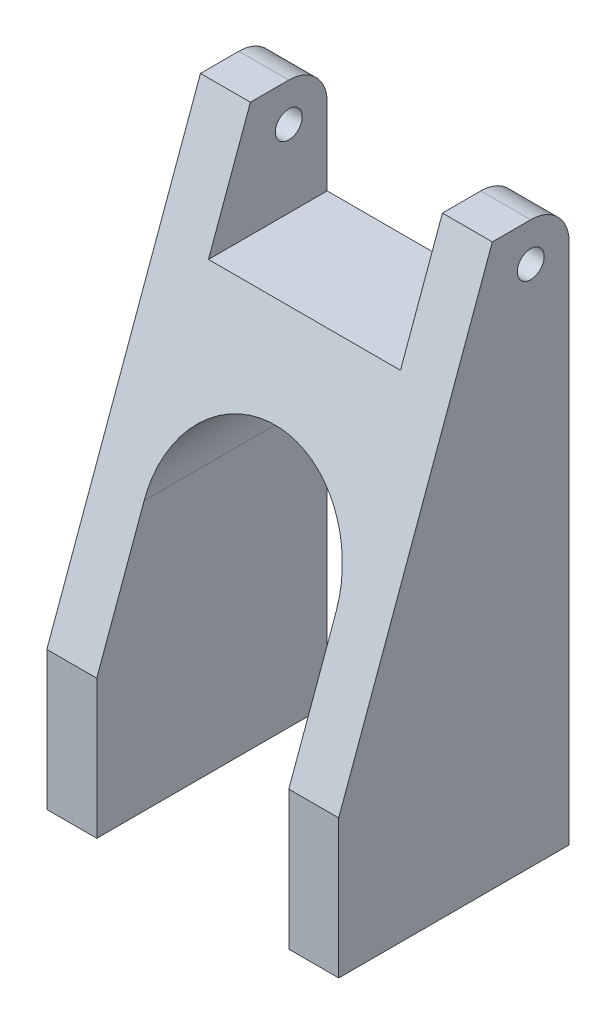
ISO-10303-21;
HEADER;
FILE_DESCRIPTION(('STEP AP214'),'2;1');
FILE_NAME('part.step','',(''),(''),'','','');
FILE_SCHEMA(('AUTOMOTIVE_DESIGN { 1 0 10303 214 1 1 1 1 }'));
ENDSEC;
DATA;
#1=APPLICATION_CONTEXT('core data for automotive mechanical design processes');
#2=APPLICATION_PROTOCOL_DEFINITION('international standard','automotive_design',2000,#1);
#3=PRODUCT_CONTEXT('',#1,'mechanical');
#4=PRODUCT('Part','Part','',(#3));
#5=PRODUCT_RELATED_PRODUCT_CATEGORY('part','',(#4));
#6=PRODUCT_DEFINITION_FORMATION('','',#4);
#7=PRODUCT_DEFINITION_CONTEXT('part definition',#1,'design');
#8=PRODUCT_DEFINITION('design','',#6,#7);
#9=PRODUCT_DEFINITION_SHAPE('','',#8);
#10=(LENGTH_UNIT() NAMED_UNIT(*) SI_UNIT(.MILLI.,.METRE.));
#11=(NAMED_UNIT(*) PLANE_ANGLE_UNIT() SI_UNIT($,.RADIAN.));
#12=(NAMED_UNIT(*) SI_UNIT($,.STERADIAN.) SOLID_ANGLE_UNIT());
#13=UNCERTAINTY_MEASURE_WITH_UNIT(LENGTH_MEASURE(1.E-05),#10,'distance_accuracy_value','');
#14=(GEOMETRIC_REPRESENTATION_CONTEXT(3) GLOBAL_UNCERTAINTY_ASSIGNED_CONTEXT((#13)) GLOBAL_UNIT_ASSIGNED_CONTEXT((#10,
#11,#12)) REPRESENTATION_CONTEXT('',''));
#15=CARTESIAN_POINT('',(0.,0.,0.));
#16=DIRECTION('',(0.,0.,1.));
#17=DIRECTION('',(1.,0.,0.));
#18=AXIS2_PLACEMENT_3D('',#15,#16,#17);
#19=CARTESIAN_POINT('',(-19.,38.,30.));
#20=DIRECTION('',(0.,-1.,0.));
#21=DIRECTION('',(0.,0.,-1.));
#22=AXIS2_PLACEMENT_3D('',#19,#20,#21);
#23=PLANE('',#22);
#24=DIRECTION('',(-1.,0.,0.));
#25=VECTOR('',#24,1.);
#26=CARTESIAN_POINT('',(-19.,38.,5.));
#27=LINE('',#26,#25);
#28=CARTESIAN_POINT('',(19.,38.,5.));
#29=VERTEX_POINT('',#28);
#30=CARTESIAN_POINT('',(12.5,38.,4.99999999999999));
#31=VERTEX_POINT('',#30);
#32=EDGE_CURVE('E163',#29,#31,#27,.T.);
#33=ORIENTED_EDGE('',*,*,#32,.T.);
#34=DIRECTION('',(0.,0.,-1.));
#35=VECTOR('',#34,1.);
#36=CARTESIAN_POINT('',(12.5,38.,-19.7984761471579));
#37=LINE('',#36,#35);
#38=CARTESIAN_POINT('',(12.5,38.,9.99999999999961));
#39=VERTEX_POINT('',#38);
#40=EDGE_CURVE('E155',#39,#31,#37,.T.);
#41=ORIENTED_EDGE('',*,*,#40,.F.);
#42=DIRECTION('',(1.,0.,0.));
#43=VECTOR('',#42,1.);
#44=CARTESIAN_POINT('',(19.,38.,9.99999999999961));
#45=LINE('',#44,#43);
#46=CARTESIAN_POINT('',(19.,38.,9.99999999999961));
#47=VERTEX_POINT('',#46);
#48=EDGE_CURVE('E64',#39,#47,#45,.T.);
#49=ORIENTED_EDGE('',*,*,#48,.T.);
#50=DIRECTION('',(0.,0.,-1.));
#51=VECTOR('',#50,1.);
#52=CARTESIAN_POINT('',(19.,38.,30.));
#53=LINE('',#52,#51);
#54=EDGE_CURVE('E286',#47,#29,#53,.T.);
#55=ORIENTED_EDGE('',*,*,#54,.T.);
#56=EDGE_LOOP('',(#33,#41,#49,#55));
#57=FACE_BOUND('',#56,.T.);
#58=ADVANCED_FACE('F39',(#57),#23,.F.);
#59=CARTESIAN_POINT('',(-19.,33.,5.));
#60=DIRECTION('',(-1.,0.,0.));
#61=DIRECTION('',(0.,0.,1.));
#62=AXIS2_PLACEMENT_3D('',#59,#60,#61);
#63=CYLINDRICAL_SURFACE('',#62,5.);
#64=CARTESIAN_POINT('',(12.5,33.,5.));
#65=DIRECTION('',(1.,0.,0.));
#66=DIRECTION('',(0.,0.,-1.));
#67=AXIS2_PLACEMENT_3D('',#64,#65,#66);
#68=CIRCLE('',#67,5.);
#69=CARTESIAN_POINT('',(12.5,33.,0.));
#70=VERTEX_POINT('',#69);
#71=EDGE_CURVE('E205',#31,#70,#68,.F.);
#72=ORIENTED_EDGE('',*,*,#71,.F.);
#73=ORIENTED_EDGE('',*,*,#32,.F.);
#74=CARTESIAN_POINT('',(19.,33.,5.));
#75=DIRECTION('',(-1.,0.,0.));
#76=DIRECTION('',(0.,0.,1.));
#77=AXIS2_PLACEMENT_3D('',#74,#75,#76);
#78=CIRCLE('',#77,5.);
#79=CARTESIAN_POINT('',(19.,33.,0.));
#80=VERTEX_POINT('',#79);
#81=EDGE_CURVE('E303',#80,#29,#78,.F.);
#82=ORIENTED_EDGE('',*,*,#81,.F.);
#83=DIRECTION('',(-1.,0.,0.));
#84=VECTOR('',#83,1.);
#85=CARTESIAN_POINT('',(0.,33.,0.));
#86=LINE('',#85,#84);
#87=EDGE_CURVE('E300',#70,#80,#86,.F.);
#88=ORIENTED_EDGE('',*,*,#87,.F.);
#89=EDGE_LOOP('',(#72,#73,#82,#88));
#90=FACE_BOUND('',#89,.T.);
#91=ADVANCED_FACE('F366',(#90),#63,.T.);
#92=CARTESIAN_POINT('',(0.,0.,30.));
#93=DIRECTION('',(0.,0.,1.));
#94=DIRECTION('',(1.,0.,0.));
#95=AXIS2_PLACEMENT_3D('',#92,#93,#94);
#96=PLANE('',#95);
#97=DIRECTION('',(0.,1.,0.));
#98=VECTOR('',#97,1.);
#99=CARTESIAN_POINT('',(19.,38.,30.));
#100=LINE('',#99,#98);
#101=CARTESIAN_POINT('',(19.,-35.,30.));
#102=VERTEX_POINT('',#101);
#103=CARTESIAN_POINT('',(19.,-16.9495483890942,30.));
#104=VERTEX_POINT('',#103);
#105=EDGE_CURVE('E250',#102,#104,#100,.T.);
#106=ORIENTED_EDGE('',*,*,#105,.T.);
#107=DIRECTION('',(-1.,0.,0.));
#108=VECTOR('',#107,1.);
#109=CARTESIAN_POINT('',(-19.,-16.9495483890942,30.));
#110=LINE('',#109,#108);
#111=CARTESIAN_POINT('',(12.5,-16.9495483890942,30.));
#112=VERTEX_POINT('',#111);
#113=EDGE_CURVE('E308',#104,#112,#110,.T.);
#114=ORIENTED_EDGE('',*,*,#113,.T.);
#115=DIRECTION('',(0.,-1.,0.));
#116=VECTOR('',#115,1.);
#117=CARTESIAN_POINT('',(12.5,-35.,30.));
#118=LINE('',#117,#116);
#119=CARTESIAN_POINT('',(12.5,-35.,30.));
#120=VERTEX_POINT('',#119);
#121=EDGE_CURVE('E245',#112,#120,#118,.T.);
#122=ORIENTED_EDGE('',*,*,#121,.T.);
#123=DIRECTION('',(1.,0.,0.));
#124=VECTOR('',#123,1.);
#125=CARTESIAN_POINT('',(12.5,-35.,30.));
#126=LINE('',#125,#124);
#127=EDGE_CURVE('E247',#120,#102,#126,.T.);
#128=ORIENTED_EDGE('',*,*,#127,.T.);
#129=EDGE_LOOP('',(#106,#114,#122,#128));
#130=FACE_BOUND('',#129,.T.);
#131=ADVANCED_FACE('F353',(#130),#96,.T.);
#132=CARTESIAN_POINT('',(0.,0.,30.));
#133=DIRECTION('',(0.,0.,-1.));
#134=DIRECTION('',(-1.,0.,0.));
#135=AXIS2_PLACEMENT_3D('',#132,#133,#134);
#136=CYLINDRICAL_SURFACE('',#135,12.5);
#137=DIRECTION('',(0.,0.,-1.));
#138=VECTOR('',#137,1.);
#139=CARTESIAN_POINT('',(12.5,0.,30.));
#140=LINE('',#139,#138);
#141=CARTESIAN_POINT('',(12.5,0.,23.8308689021151));
#142=VERTEX_POINT('',#141);
#143=CARTESIAN_POINT('',(12.5,0.,0.));
#144=VERTEX_POINT('',#143);
#145=EDGE_CURVE('E294',#142,#144,#140,.T.);
#146=ORIENTED_EDGE('',*,*,#145,.F.);
#147=CARTESIAN_POINT('',(0.,0.,23.8308689021151));
#148=DIRECTION('',(0.,0.342020143325665,0.93969262078591));
#149=DIRECTION('',(0.,0.93969262078591,-0.342020143325665));
#150=AXIS2_PLACEMENT_3D('',#147,#148,#149);
#151=ELLIPSE('',#150,13.3022221559489,12.5);
#152=CARTESIAN_POINT('',(-12.5,0.,23.8308689021151));
#153=VERTEX_POINT('',#152);
#154=EDGE_CURVE('E313',#142,#153,#151,.T.);
#155=ORIENTED_EDGE('',*,*,#154,.T.);
#156=DIRECTION('',(0.,0.,-1.));
#157=VECTOR('',#156,1.);
#158=CARTESIAN_POINT('',(-12.5,0.,30.));
#159=LINE('',#158,#157);
#160=CARTESIAN_POINT('',(-12.5,0.,0.));
#161=VERTEX_POINT('',#160);
#162=EDGE_CURVE('E260',#153,#161,#159,.T.);
#163=ORIENTED_EDGE('',*,*,#162,.T.);
#164=CARTESIAN_POINT('',(0.,0.,0.));
#165=DIRECTION('',(0.,0.,-1.));
#166=DIRECTION('',(1.,0.,0.));
#167=AXIS2_PLACEMENT_3D('',#164,#165,#166);
#168=CIRCLE('',#167,12.5);
#169=EDGE_CURVE('E242',#161,#144,#168,.T.);
#170=ORIENTED_EDGE('',*,*,#169,.T.);
#171=EDGE_LOOP('',(#146,#155,#163,#170));
#172=FACE_BOUND('',#171,.T.);
#173=ADVANCED_FACE('F349',(#172),#136,.F.);
#174=CARTESIAN_POINT('',(12.5,-35.,30.));
#175=DIRECTION('',(1.,0.,0.));
#176=DIRECTION('',(0.,1.,0.));
#177=AXIS2_PLACEMENT_3D('',#174,#175,#176);
#178=PLANE('',#177);
#179=ORIENTED_EDGE('',*,*,#121,.F.);
#180=DIRECTION('',(0.,0.93969262078591,-0.342020143325665));
#181=VECTOR('',#180,1.);
#182=CARTESIAN_POINT('',(12.5,-16.9495483890942,30.));
#183=LINE('',#182,#181);
#184=EDGE_CURVE('E311',#112,#142,#183,.T.);
#185=ORIENTED_EDGE('',*,*,#184,.T.);
#186=ORIENTED_EDGE('',*,*,#145,.T.);
#187=DIRECTION('',(0.,-1.,0.));
#188=VECTOR('',#187,1.);
#189=CARTESIAN_POINT('',(12.5,-35.,0.));
#190=LINE('',#189,#188);
#191=CARTESIAN_POINT('',(12.5,-35.,0.));
#192=VERTEX_POINT('',#191);
#193=EDGE_CURVE('E263',#144,#192,#190,.T.);
#194=ORIENTED_EDGE('',*,*,#193,.T.);
#195=DIRECTION('',(0.,0.,-1.));
#196=VECTOR('',#195,1.);
#197=CARTESIAN_POINT('',(12.5,-35.,30.));
#198=LINE('',#197,#196);
#199=EDGE_CURVE('E291',#120,#192,#198,.T.);
#200=ORIENTED_EDGE('',*,*,#199,.F.);
#201=EDGE_LOOP('',(#179,#185,#186,#194,#200));
#202=FACE_BOUND('',#201,.T.);
#203=ADVANCED_FACE('F356',(#202),#178,.F.);
#204=CARTESIAN_POINT('',(12.5,-35.,30.));
#205=DIRECTION('',(0.,1.,0.));
#206=DIRECTION('',(-1.,0.,0.));
#207=AXIS2_PLACEMENT_3D('',#204,#205,#206);
#208=PLANE('',#207);
#209=CARTESIAN_POINT('',(15.,-35.,15.));
#210=DIRECTION('',(0.,-1.,0.));
#211=DIRECTION('',(0.,0.,-1.));
#212=AXIS2_PLACEMENT_3D('',#209,#210,#211);
#213=CIRCLE('',#212,2.);
#214=CARTESIAN_POINT('',(15.,-35.,13.));
#215=VERTEX_POINT('',#214);
#216=EDGE_CURVE('E215',#215,#215,#213,.T.);
#217=ORIENTED_EDGE('',*,*,#216,.F.);
#218=EDGE_LOOP('',(#217));
#219=FACE_BOUND('',#218,.T.);
#220=CARTESIAN_POINT('',(15.,-35.,5.));
#221=DIRECTION('',(0.,-1.,0.));
#222=DIRECTION('',(0.,0.,-1.));
#223=AXIS2_PLACEMENT_3D('',#220,#221,#222);
#224=CIRCLE('',#223,2.);
#225=CARTESIAN_POINT('',(15.,-35.,3.));
#226=VERTEX_POINT('',#225);
#227=EDGE_CURVE('E227',#226,#226,#224,.T.);
#228=ORIENTED_EDGE('',*,*,#227,.F.);
#229=EDGE_LOOP('',(#228));
#230=FACE_BOUND('',#229,.T.);
#231=CARTESIAN_POINT('',(15.,-35.,25.));
#232=DIRECTION('',(0.,-1.,0.));
#233=DIRECTION('',(0.,0.,-1.));
#234=AXIS2_PLACEMENT_3D('',#231,#232,#233);
#235=CIRCLE('',#234,2.);
#236=CARTESIAN_POINT('',(15.,-35.,23.));
#237=VERTEX_POINT('',#236);
#238=EDGE_CURVE('E209',#237,#237,#235,.T.);
#239=ORIENTED_EDGE('',*,*,#238,.F.);
#240=EDGE_LOOP('',(#239));
#241=FACE_BOUND('',#240,.T.);
#242=DIRECTION('',(1.,0.,0.));
#243=VECTOR('',#242,1.);
#244=CARTESIAN_POINT('',(12.5,-35.,0.));
#245=LINE('',#244,#243);
#246=CARTESIAN_POINT('',(19.,-35.,0.));
#247=VERTEX_POINT('',#246);
#248=EDGE_CURVE('E265',#192,#247,#245,.T.);
#249=ORIENTED_EDGE('',*,*,#248,.T.);
#250=DIRECTION('',(0.,0.,-1.));
#251=VECTOR('',#250,1.);
#252=CARTESIAN_POINT('',(19.,-35.,30.));
#253=LINE('',#252,#251);
#254=EDGE_CURVE('E288',#102,#247,#253,.T.);
#255=ORIENTED_EDGE('',*,*,#254,.F.);
#256=ORIENTED_EDGE('',*,*,#127,.F.);
#257=ORIENTED_EDGE('',*,*,#199,.T.);
#258=EDGE_LOOP('',(#249,#255,#256,#257));
#259=FACE_BOUND('',#258,.T.);
#260=ADVANCED_FACE('F360',(#219,#230,#241,#259),#208,.F.);
#261=CARTESIAN_POINT('',(19.,38.,30.));
#262=DIRECTION('',(-1.,0.,0.));
#263=DIRECTION('',(0.,0.,1.));
#264=AXIS2_PLACEMENT_3D('',#261,#262,#263);
#265=PLANE('',#264);
#266=CARTESIAN_POINT('',(19.,33.,5.));
#267=DIRECTION('',(-1.,0.,0.));
#268=DIRECTION('',(0.,0.,1.));
#269=AXIS2_PLACEMENT_3D('',#266,#267,#268);
#270=CIRCLE('',#269,1.75);
#271=CARTESIAN_POINT('',(19.,33.,6.75));
#272=VERTEX_POINT('',#271);
#273=EDGE_CURVE('E635',#272,#272,#270,.T.);
#274=ORIENTED_EDGE('',*,*,#273,.T.);
#275=EDGE_LOOP('',(#274));
#276=FACE_BOUND('',#275,.T.);
#277=ORIENTED_EDGE('',*,*,#54,.F.);
#278=DIRECTION('',(0.,-0.93969262078591,0.342020143325665));
#279=VECTOR('',#278,1.);
#280=CARTESIAN_POINT('',(19.,-16.9495483890942,30.));
#281=LINE('',#280,#279);
#282=EDGE_CURVE('E169',#47,#104,#281,.T.);
#283=ORIENTED_EDGE('',*,*,#282,.T.);
#284=ORIENTED_EDGE('',*,*,#105,.F.);
#285=ORIENTED_EDGE('',*,*,#254,.T.);
#286=DIRECTION('',(0.,1.,0.));
#287=VECTOR('',#286,1.);
#288=CARTESIAN_POINT('',(19.,38.,0.));
#289=LINE('',#288,#287);
#290=EDGE_CURVE('E267',#247,#80,#289,.T.);
#291=ORIENTED_EDGE('',*,*,#290,.T.);
#292=ORIENTED_EDGE('',*,*,#81,.T.);
#293=EDGE_LOOP('',(#277,#283,#284,#285,#291,#292));
#294=FACE_BOUND('',#293,.T.);
#295=ADVANCED_FACE('F363',(#276,#294),#265,.F.);
#296=CARTESIAN_POINT('',(-19.,38.,9.99999999999961));
#297=VERTEX_POINT('',#296);
#298=CARTESIAN_POINT('',(-12.5,38.,9.99999999999961));
#299=VERTEX_POINT('',#298);
#300=EDGE_CURVE('E170',#297,#299,#45,.T.);
#301=ORIENTED_EDGE('',*,*,#300,.T.);
#302=DIRECTION('',(0.,0.,1.));
#303=VECTOR('',#302,1.);
#304=CARTESIAN_POINT('',(-12.5,38.,-19.7984761471579));
#305=LINE('',#304,#303);
#306=CARTESIAN_POINT('',(-12.5,38.,4.99999999999999));
#307=VERTEX_POINT('',#306);
#308=EDGE_CURVE('E164',#307,#299,#305,.T.);
#309=ORIENTED_EDGE('',*,*,#308,.F.);
#310=CARTESIAN_POINT('',(-19.,38.,5.));
#311=VERTEX_POINT('',#310);
#312=EDGE_CURVE('E296',#307,#311,#27,.T.);
#313=ORIENTED_EDGE('',*,*,#312,.T.);
#314=DIRECTION('',(0.,0.,-1.));
#315=VECTOR('',#314,1.);
#316=CARTESIAN_POINT('',(-19.,38.,30.));
#317=LINE('',#316,#315);
#318=EDGE_CURVE('E283',#297,#311,#317,.T.);
#319=ORIENTED_EDGE('',*,*,#318,.F.);
#320=EDGE_LOOP('',(#301,#309,#313,#319));
#321=FACE_BOUND('',#320,.T.);
#322=ADVANCED_FACE('F333',(#321),#23,.F.);
#323=CARTESIAN_POINT('',(-19.,-35.,30.));
#324=DIRECTION('',(1.,0.,0.));
#325=DIRECTION('',(0.,0.,-1.));
#326=AXIS2_PLACEMENT_3D('',#323,#324,#325);
#327=PLANE('',#326);
#328=CARTESIAN_POINT('',(-19.,33.,5.));
#329=DIRECTION('',(-1.,0.,0.));
#330=DIRECTION('',(0.,0.,1.));
#331=AXIS2_PLACEMENT_3D('',#328,#329,#330);
#332=CIRCLE('',#331,1.75);
#333=CARTESIAN_POINT('',(-19.,33.,6.75));
#334=VERTEX_POINT('',#333);
#335=EDGE_CURVE('E641',#334,#334,#332,.T.);
#336=ORIENTED_EDGE('',*,*,#335,.F.);
#337=EDGE_LOOP('',(#336));
#338=FACE_BOUND('',#337,.T.);
#339=DIRECTION('',(0.,-1.,0.));
#340=VECTOR('',#339,1.);
#341=CARTESIAN_POINT('',(-19.,-35.,30.));
#342=LINE('',#341,#340);
#343=CARTESIAN_POINT('',(-19.,-16.9495483890942,30.));
#344=VERTEX_POINT('',#343);
#345=CARTESIAN_POINT('',(-19.,-35.,30.));
#346=VERTEX_POINT('',#345);
#347=EDGE_CURVE('E253',#344,#346,#342,.T.);
#348=ORIENTED_EDGE('',*,*,#347,.F.);
#349=DIRECTION('',(0.,0.93969262078591,-0.342020143325665));
#350=VECTOR('',#349,1.);
#351=CARTESIAN_POINT('',(-19.,-16.9495483890942,30.));
#352=LINE('',#351,#350);
#353=EDGE_CURVE('E171',#344,#297,#352,.T.);
#354=ORIENTED_EDGE('',*,*,#353,.T.);
#355=ORIENTED_EDGE('',*,*,#318,.T.);
#356=CARTESIAN_POINT('',(-19.,33.,5.));
#357=DIRECTION('',(1.,0.,0.));
#358=DIRECTION('',(0.,0.,-1.));
#359=AXIS2_PLACEMENT_3D('',#356,#357,#358);
#360=CIRCLE('',#359,5.);
#361=CARTESIAN_POINT('',(-19.,33.,0.));
#362=VERTEX_POINT('',#361);
#363=EDGE_CURVE('E298',#311,#362,#360,.F.);
#364=ORIENTED_EDGE('',*,*,#363,.T.);
#365=DIRECTION('',(0.,-1.,0.));
#366=VECTOR('',#365,1.);
#367=CARTESIAN_POINT('',(-19.,-35.,0.));
#368=LINE('',#367,#366);
#369=CARTESIAN_POINT('',(-19.,-35.,0.));
#370=VERTEX_POINT('',#369);
#371=EDGE_CURVE('E270',#362,#370,#368,.T.);
#372=ORIENTED_EDGE('',*,*,#371,.T.);
#373=DIRECTION('',(0.,0.,-1.));
#374=VECTOR('',#373,1.);
#375=CARTESIAN_POINT('',(-19.,-35.,30.));
#376=LINE('',#375,#374);
#377=EDGE_CURVE('E280',#346,#370,#376,.T.);
#378=ORIENTED_EDGE('',*,*,#377,.F.);
#379=EDGE_LOOP('',(#348,#354,#355,#364,#372,#378));
#380=FACE_BOUND('',#379,.T.);
#381=ADVANCED_FACE('F329',(#338,#380),#327,.F.);
#382=CARTESIAN_POINT('',(-19.,-35.,30.));
#383=DIRECTION('',(0.,1.,0.));
#384=DIRECTION('',(-1.,0.,0.));
#385=AXIS2_PLACEMENT_3D('',#382,#383,#384);
#386=PLANE('',#385);
#387=CARTESIAN_POINT('',(-15.,-35.,25.));
#388=DIRECTION('',(0.,-1.,0.));
#389=DIRECTION('',(0.,0.,-1.));
#390=AXIS2_PLACEMENT_3D('',#387,#388,#389);
#391=CIRCLE('',#390,2.);
#392=CARTESIAN_POINT('',(-15.,-35.,23.));
#393=VERTEX_POINT('',#392);
#394=EDGE_CURVE('E222',#393,#393,#391,.T.);
#395=ORIENTED_EDGE('',*,*,#394,.F.);
#396=EDGE_LOOP('',(#395));
#397=FACE_BOUND('',#396,.T.);
#398=CARTESIAN_POINT('',(-15.,-35.,15.));
#399=DIRECTION('',(0.,-1.,0.));
#400=DIRECTION('',(0.,0.,-1.));
#401=AXIS2_PLACEMENT_3D('',#398,#399,#400);
#402=CIRCLE('',#401,2.);
#403=CARTESIAN_POINT('',(-15.,-35.,13.));
#404=VERTEX_POINT('',#403);
#405=EDGE_CURVE('E234',#404,#404,#402,.T.);
#406=ORIENTED_EDGE('',*,*,#405,.F.);
#407=EDGE_LOOP('',(#406));
#408=FACE_BOUND('',#407,.T.);
#409=CARTESIAN_POINT('',(-15.,-35.,5.));
#410=DIRECTION('',(0.,-1.,0.));
#411=DIRECTION('',(0.,0.,-1.));
#412=AXIS2_PLACEMENT_3D('',#409,#410,#411);
#413=CIRCLE('',#412,2.);
#414=CARTESIAN_POINT('',(-15.,-35.,3.));
#415=VERTEX_POINT('',#414);
#416=EDGE_CURVE('E230',#415,#415,#413,.T.);
#417=ORIENTED_EDGE('',*,*,#416,.F.);
#418=EDGE_LOOP('',(#417));
#419=FACE_BOUND('',#418,.T.);
#420=DIRECTION('',(1.,0.,0.));
#421=VECTOR('',#420,1.);
#422=CARTESIAN_POINT('',(-19.,-35.,0.));
#423=LINE('',#422,#421);
#424=CARTESIAN_POINT('',(-12.5,-35.,0.));
#425=VERTEX_POINT('',#424);
#426=EDGE_CURVE('E272',#370,#425,#423,.T.);
#427=ORIENTED_EDGE('',*,*,#426,.T.);
#428=DIRECTION('',(0.,0.,-1.));
#429=VECTOR('',#428,1.);
#430=CARTESIAN_POINT('',(-12.5,-35.,30.));
#431=LINE('',#430,#429);
#432=CARTESIAN_POINT('',(-12.5,-35.,30.));
#433=VERTEX_POINT('',#432);
#434=EDGE_CURVE('E277',#433,#425,#431,.T.);
#435=ORIENTED_EDGE('',*,*,#434,.F.);
#436=DIRECTION('',(1.,0.,0.));
#437=VECTOR('',#436,1.);
#438=CARTESIAN_POINT('',(-19.,-35.,30.));
#439=LINE('',#438,#437);
#440=EDGE_CURVE('E255',#346,#433,#439,.T.);
#441=ORIENTED_EDGE('',*,*,#440,.F.);
#442=ORIENTED_EDGE('',*,*,#377,.T.);
#443=EDGE_LOOP('',(#427,#435,#441,#442));
#444=FACE_BOUND('',#443,.T.);
#445=ADVANCED_FACE('F344',(#397,#408,#419,#444),#386,.F.);
#446=CARTESIAN_POINT('',(-12.5,0.,30.));
#447=DIRECTION('',(-1.,0.,0.));
#448=DIRECTION('',(0.,-1.,0.));
#449=AXIS2_PLACEMENT_3D('',#446,#447,#448);
#450=PLANE('',#449);
#451=ORIENTED_EDGE('',*,*,#162,.F.);
#452=DIRECTION('',(0.,-0.93969262078591,0.342020143325665));
#453=VECTOR('',#452,1.);
#454=CARTESIAN_POINT('',(-12.5,-16.9495483890942,30.));
#455=LINE('',#454,#453);
#456=CARTESIAN_POINT('',(-12.5,-16.9495483890942,30.));
#457=VERTEX_POINT('',#456);
#458=EDGE_CURVE('E174',#153,#457,#455,.T.);
#459=ORIENTED_EDGE('',*,*,#458,.T.);
#460=DIRECTION('',(0.,1.,0.));
#461=VECTOR('',#460,1.);
#462=CARTESIAN_POINT('',(-12.5,0.,30.));
#463=LINE('',#462,#461);
#464=EDGE_CURVE('E257',#433,#457,#463,.T.);
#465=ORIENTED_EDGE('',*,*,#464,.F.);
#466=ORIENTED_EDGE('',*,*,#434,.T.);
#467=DIRECTION('',(0.,1.,0.));
#468=VECTOR('',#467,1.);
#469=CARTESIAN_POINT('',(-12.5,0.,0.));
#470=LINE('',#469,#468);
#471=EDGE_CURVE('E248',#425,#161,#470,.T.);
#472=ORIENTED_EDGE('',*,*,#471,.T.);
#473=EDGE_LOOP('',(#451,#459,#465,#466,#472));
#474=FACE_BOUND('',#473,.T.);
#475=ADVANCED_FACE('F318',(#474),#450,.F.);
#476=ORIENTED_EDGE('',*,*,#464,.T.);
#477=DIRECTION('',(-1.,0.,0.));
#478=VECTOR('',#477,1.);
#479=CARTESIAN_POINT('',(-19.,-16.9495483890942,30.));
#480=LINE('',#479,#478);
#481=EDGE_CURVE('E306',#457,#344,#480,.T.);
#482=ORIENTED_EDGE('',*,*,#481,.T.);
#483=ORIENTED_EDGE('',*,*,#347,.T.);
#484=ORIENTED_EDGE('',*,*,#440,.T.);
#485=EDGE_LOOP('',(#476,#482,#483,#484));
#486=FACE_BOUND('',#485,.T.);
#487=ADVANCED_FACE('F322',(#486),#96,.T.);
#488=CARTESIAN_POINT('',(0.,0.,0.));
#489=DIRECTION('',(0.,0.,1.));
#490=DIRECTION('',(1.,0.,0.));
#491=AXIS2_PLACEMENT_3D('',#488,#489,#490);
#492=PLANE('',#491);
#493=DIRECTION('',(-1.,0.,0.));
#494=VECTOR('',#493,1.);
#495=CARTESIAN_POINT('',(0.,23.,0.));
#496=LINE('',#495,#494);
#497=CARTESIAN_POINT('',(12.5,23.,0.));
#498=VERTEX_POINT('',#497);
#499=CARTESIAN_POINT('',(-12.5,23.,0.));
#500=VERTEX_POINT('',#499);
#501=EDGE_CURVE('E189',#498,#500,#496,.T.);
#502=ORIENTED_EDGE('',*,*,#501,.F.);
#503=DIRECTION('',(0.,1.,0.));
#504=VECTOR('',#503,1.);
#505=CARTESIAN_POINT('',(12.5,0.,0.));
#506=LINE('',#505,#504);
#507=EDGE_CURVE('E194',#498,#70,#506,.T.);
#508=ORIENTED_EDGE('',*,*,#507,.T.);
#509=ORIENTED_EDGE('',*,*,#87,.T.);
#510=ORIENTED_EDGE('',*,*,#290,.F.);
#511=ORIENTED_EDGE('',*,*,#248,.F.);
#512=ORIENTED_EDGE('',*,*,#193,.F.);
#513=ORIENTED_EDGE('',*,*,#169,.F.);
#514=ORIENTED_EDGE('',*,*,#471,.F.);
#515=ORIENTED_EDGE('',*,*,#426,.F.);
#516=ORIENTED_EDGE('',*,*,#371,.F.);
#517=CARTESIAN_POINT('',(-12.5,33.,0.));
#518=VERTEX_POINT('',#517);
#519=EDGE_CURVE('E301',#362,#518,#86,.F.);
#520=ORIENTED_EDGE('',*,*,#519,.T.);
#521=DIRECTION('',(0.,-1.,0.));
#522=VECTOR('',#521,1.);
#523=CARTESIAN_POINT('',(-12.5,0.,0.));
#524=LINE('',#523,#522);
#525=EDGE_CURVE('E197',#518,#500,#524,.T.);
#526=ORIENTED_EDGE('',*,*,#525,.T.);
#527=EDGE_LOOP('',(#502,#508,#509,#510,#511,#512,#513,#514,#515,#516,#520,#526));
#528=FACE_BOUND('',#527,.T.);
#529=ADVANCED_FACE('F193',(#528),#492,.F.);
#530=CARTESIAN_POINT('',(-15.,-20.,5.));
#531=DIRECTION('',(0.,-1.,0.));
#532=DIRECTION('',(0.,0.,-1.));
#533=AXIS2_PLACEMENT_3D('',#530,#531,#532);
#534=CYLINDRICAL_SURFACE('',#533,2.);
#535=CARTESIAN_POINT('',(-15.,-20.,5.));
#536=DIRECTION('',(0.,-1.,0.));
#537=DIRECTION('',(0.,0.,-1.));
#538=AXIS2_PLACEMENT_3D('',#535,#536,#537);
#539=CIRCLE('',#538,2.);
#540=CARTESIAN_POINT('',(-15.,-20.,3.));
#541=VERTEX_POINT('',#540);
#542=EDGE_CURVE('E239',#541,#541,#539,.T.);
#543=ORIENTED_EDGE('',*,*,#542,.F.);
#544=EDGE_LOOP('',(#543));
#545=FACE_BOUND('',#544,.T.);
#546=ORIENTED_EDGE('',*,*,#416,.T.);
#547=EDGE_LOOP('',(#546));
#548=FACE_BOUND('',#547,.T.);
#549=ADVANCED_FACE('F420',(#545,#548),#534,.F.);
#550=CARTESIAN_POINT('',(-15.,-20.,5.));
#551=DIRECTION('',(0.,-1.,0.));
#552=DIRECTION('',(0.,0.,-1.));
#553=AXIS2_PLACEMENT_3D('',#550,#551,#552);
#554=PLANE('',#553);
#555=ORIENTED_EDGE('',*,*,#542,.T.);
#556=EDGE_LOOP('',(#555));
#557=FACE_BOUND('',#556,.T.);
#558=ADVANCED_FACE('F413',(#557),#554,.T.);
#559=CARTESIAN_POINT('',(-15.,-20.,15.));
#560=DIRECTION('',(0.,-1.,0.));
#561=DIRECTION('',(0.,0.,-1.));
#562=AXIS2_PLACEMENT_3D('',#559,#560,#561);
#563=CYLINDRICAL_SURFACE('',#562,2.);
#564=CARTESIAN_POINT('',(-15.,-20.,15.));
#565=DIRECTION('',(0.,-1.,0.));
#566=DIRECTION('',(0.,0.,-1.));
#567=AXIS2_PLACEMENT_3D('',#564,#565,#566);
#568=CIRCLE('',#567,2.);
#569=CARTESIAN_POINT('',(-15.,-20.,13.));
#570=VERTEX_POINT('',#569);
#571=EDGE_CURVE('E218',#570,#570,#568,.T.);
#572=ORIENTED_EDGE('',*,*,#571,.F.);
#573=EDGE_LOOP('',(#572));
#574=FACE_BOUND('',#573,.T.);
#575=ORIENTED_EDGE('',*,*,#405,.T.);
#576=EDGE_LOOP('',(#575));
#577=FACE_BOUND('',#576,.T.);
#578=ADVANCED_FACE('F410',(#574,#577),#563,.F.);
#579=CARTESIAN_POINT('',(-15.,-20.,15.));
#580=DIRECTION('',(0.,-1.,0.));
#581=DIRECTION('',(0.,0.,-1.));
#582=AXIS2_PLACEMENT_3D('',#579,#580,#581);
#583=PLANE('',#582);
#584=ORIENTED_EDGE('',*,*,#571,.T.);
#585=EDGE_LOOP('',(#584));
#586=FACE_BOUND('',#585,.T.);
#587=ADVANCED_FACE('F396',(#586),#583,.T.);
#588=CARTESIAN_POINT('',(-15.,-20.,25.));
#589=DIRECTION('',(0.,-1.,0.));
#590=DIRECTION('',(0.,0.,-1.));
#591=AXIS2_PLACEMENT_3D('',#588,#589,#590);
#592=CYLINDRICAL_SURFACE('',#591,2.);
#593=CARTESIAN_POINT('',(-15.,-20.,25.));
#594=DIRECTION('',(0.,-1.,0.));
#595=DIRECTION('',(0.,0.,-1.));
#596=AXIS2_PLACEMENT_3D('',#593,#594,#595);
#597=CIRCLE('',#596,2.);
#598=CARTESIAN_POINT('',(-15.,-20.,23.));
#599=VERTEX_POINT('',#598);
#600=EDGE_CURVE('E212',#599,#599,#597,.T.);
#601=ORIENTED_EDGE('',*,*,#600,.F.);
#602=EDGE_LOOP('',(#601));
#603=FACE_BOUND('',#602,.T.);
#604=ORIENTED_EDGE('',*,*,#394,.T.);
#605=EDGE_LOOP('',(#604));
#606=FACE_BOUND('',#605,.T.);
#607=ADVANCED_FACE('F392',(#603,#606),#592,.F.);
#608=CARTESIAN_POINT('',(-15.,-20.,25.));
#609=DIRECTION('',(0.,-1.,0.));
#610=DIRECTION('',(0.,0.,-1.));
#611=AXIS2_PLACEMENT_3D('',#608,#609,#610);
#612=PLANE('',#611);
#613=ORIENTED_EDGE('',*,*,#600,.T.);
#614=EDGE_LOOP('',(#613));
#615=FACE_BOUND('',#614,.T.);
#616=ADVANCED_FACE('F395',(#615),#612,.T.);
#617=CARTESIAN_POINT('',(15.,-20.,25.));
#618=DIRECTION('',(0.,-1.,0.));
#619=DIRECTION('',(0.,0.,-1.));
#620=AXIS2_PLACEMENT_3D('',#617,#618,#619);
#621=CYLINDRICAL_SURFACE('',#620,2.);
#622=CARTESIAN_POINT('',(15.,-20.,25.));
#623=DIRECTION('',(0.,-1.,0.));
#624=DIRECTION('',(0.,0.,-1.));
#625=AXIS2_PLACEMENT_3D('',#622,#623,#624);
#626=CIRCLE('',#625,2.);
#627=CARTESIAN_POINT('',(15.,-20.,23.));
#628=VERTEX_POINT('',#627);
#629=EDGE_CURVE('E208',#628,#628,#626,.T.);
#630=ORIENTED_EDGE('',*,*,#629,.F.);
#631=EDGE_LOOP('',(#630));
#632=FACE_BOUND('',#631,.T.);
#633=ORIENTED_EDGE('',*,*,#238,.T.);
#634=EDGE_LOOP('',(#633));
#635=FACE_BOUND('',#634,.T.);
#636=ADVANCED_FACE('F400',(#632,#635),#621,.F.);
#637=CARTESIAN_POINT('',(15.,-20.,25.));
#638=DIRECTION('',(0.,-1.,0.));
#639=DIRECTION('',(0.,0.,-1.));
#640=AXIS2_PLACEMENT_3D('',#637,#638,#639);
#641=PLANE('',#640);
#642=ORIENTED_EDGE('',*,*,#629,.T.);
#643=EDGE_LOOP('',(#642));
#644=FACE_BOUND('',#643,.T.);
#645=ADVANCED_FACE('F405',(#644),#641,.T.);
#646=CARTESIAN_POINT('',(15.,-20.,5.));
#647=DIRECTION('',(0.,-1.,0.));
#648=DIRECTION('',(0.,0.,-1.));
#649=AXIS2_PLACEMENT_3D('',#646,#647,#648);
#650=CYLINDRICAL_SURFACE('',#649,2.);
#651=CARTESIAN_POINT('',(15.,-20.,5.));
#652=DIRECTION('',(0.,-1.,0.));
#653=DIRECTION('',(0.,0.,-1.));
#654=AXIS2_PLACEMENT_3D('',#651,#652,#653);
#655=CIRCLE('',#654,2.);
#656=CARTESIAN_POINT('',(15.,-20.,3.));
#657=VERTEX_POINT('',#656);
#658=EDGE_CURVE('E231',#657,#657,#655,.T.);
#659=ORIENTED_EDGE('',*,*,#658,.F.);
#660=EDGE_LOOP('',(#659));
#661=FACE_BOUND('',#660,.T.);
#662=ORIENTED_EDGE('',*,*,#227,.T.);
#663=EDGE_LOOP('',(#662));
#664=FACE_BOUND('',#663,.T.);
#665=ADVANCED_FACE('F402',(#661,#664),#650,.F.);
#666=CARTESIAN_POINT('',(15.,-20.,5.));
#667=DIRECTION('',(0.,-1.,0.));
#668=DIRECTION('',(0.,0.,-1.));
#669=AXIS2_PLACEMENT_3D('',#666,#667,#668);
#670=PLANE('',#669);
#671=ORIENTED_EDGE('',*,*,#658,.T.);
#672=EDGE_LOOP('',(#671));
#673=FACE_BOUND('',#672,.T.);
#674=ADVANCED_FACE('F387',(#673),#670,.T.);
#675=CARTESIAN_POINT('',(15.,-20.,15.));
#676=DIRECTION('',(0.,-1.,0.));
#677=DIRECTION('',(0.,0.,-1.));
#678=AXIS2_PLACEMENT_3D('',#675,#676,#677);
#679=CYLINDRICAL_SURFACE('',#678,2.);
#680=CARTESIAN_POINT('',(15.,-20.,15.));
#681=DIRECTION('',(0.,-1.,0.));
#682=DIRECTION('',(0.,0.,-1.));
#683=AXIS2_PLACEMENT_3D('',#680,#681,#682);
#684=CIRCLE('',#683,2.);
#685=CARTESIAN_POINT('',(15.,-20.,13.));
#686=VERTEX_POINT('',#685);
#687=EDGE_CURVE('E219',#686,#686,#684,.T.);
#688=ORIENTED_EDGE('',*,*,#687,.F.);
#689=EDGE_LOOP('',(#688));
#690=FACE_BOUND('',#689,.T.);
#691=ORIENTED_EDGE('',*,*,#216,.T.);
#692=EDGE_LOOP('',(#691));
#693=FACE_BOUND('',#692,.T.);
#694=ADVANCED_FACE('F381',(#690,#693),#679,.F.);
#695=CARTESIAN_POINT('',(15.,-20.,15.));
#696=DIRECTION('',(0.,-1.,0.));
#697=DIRECTION('',(0.,0.,-1.));
#698=AXIS2_PLACEMENT_3D('',#695,#696,#697);
#699=PLANE('',#698);
#700=ORIENTED_EDGE('',*,*,#687,.T.);
#701=EDGE_LOOP('',(#700));
#702=FACE_BOUND('',#701,.T.);
#703=ADVANCED_FACE('F376',(#702),#699,.T.);
#704=CARTESIAN_POINT('',(-12.5,33.,5.));
#705=DIRECTION('',(-1.,0.,0.));
#706=DIRECTION('',(0.,0.,1.));
#707=AXIS2_PLACEMENT_3D('',#704,#705,#706);
#708=CIRCLE('',#707,5.);
#709=EDGE_CURVE('E198',#518,#307,#708,.F.);
#710=ORIENTED_EDGE('',*,*,#709,.F.);
#711=ORIENTED_EDGE('',*,*,#519,.F.);
#712=ORIENTED_EDGE('',*,*,#363,.F.);
#713=ORIENTED_EDGE('',*,*,#312,.F.);
#714=EDGE_LOOP('',(#710,#711,#712,#713));
#715=FACE_BOUND('',#714,.T.);
#716=ADVANCED_FACE('F337',(#715),#63,.T.);
#717=CARTESIAN_POINT('',(0.,-16.9495483890942,30.));
#718=DIRECTION('',(0.,0.342020143325665,0.93969262078591));
#719=DIRECTION('',(1.,0.,0.));
#720=AXIS2_PLACEMENT_3D('',#717,#718,#719);
#721=PLANE('',#720);
#722=DIRECTION('',(0.,0.93969262078591,-0.342020143325665));
#723=VECTOR('',#722,1.);
#724=CARTESIAN_POINT('',(12.5,-16.9495483890942,30.));
#725=LINE('',#724,#723);
#726=CARTESIAN_POINT('',(12.5,23.,15.4595535139926));
#727=VERTEX_POINT('',#726);
#728=EDGE_CURVE('E11',#727,#39,#725,.T.);
#729=ORIENTED_EDGE('',*,*,#728,.F.);
#730=DIRECTION('',(-1.,0.,0.));
#731=VECTOR('',#730,1.);
#732=CARTESIAN_POINT('',(0.,23.,15.4595535139926));
#733=LINE('',#732,#731);
#734=CARTESIAN_POINT('',(-12.5,23.,15.4595535139926));
#735=VERTEX_POINT('',#734);
#736=EDGE_CURVE('E179',#727,#735,#733,.T.);
#737=ORIENTED_EDGE('',*,*,#736,.T.);
#738=DIRECTION('',(0.,-0.93969262078591,0.342020143325665));
#739=VECTOR('',#738,1.);
#740=CARTESIAN_POINT('',(-12.5,-16.9495483890942,30.));
#741=LINE('',#740,#739);
#742=EDGE_CURVE('E49',#299,#735,#741,.T.);
#743=ORIENTED_EDGE('',*,*,#742,.F.);
#744=ORIENTED_EDGE('',*,*,#300,.F.);
#745=ORIENTED_EDGE('',*,*,#353,.F.);
#746=ORIENTED_EDGE('',*,*,#481,.F.);
#747=ORIENTED_EDGE('',*,*,#458,.F.);
#748=ORIENTED_EDGE('',*,*,#154,.F.);
#749=ORIENTED_EDGE('',*,*,#184,.F.);
#750=ORIENTED_EDGE('',*,*,#113,.F.);
#751=ORIENTED_EDGE('',*,*,#282,.F.);
#752=ORIENTED_EDGE('',*,*,#48,.F.);
#753=EDGE_LOOP('',(#729,#737,#743,#744,#745,#746,#747,#748,#749,#750,#751,#752));
#754=FACE_BOUND('',#753,.T.);
#755=ADVANCED_FACE('F42',(#754),#721,.T.);
#756=CARTESIAN_POINT('',(12.5,23.,-19.7984761471579));
#757=DIRECTION('',(1.,0.,0.));
#758=DIRECTION('',(0.,0.,-1.));
#759=AXIS2_PLACEMENT_3D('',#756,#757,#758);
#760=PLANE('',#759);
#761=CARTESIAN_POINT('',(12.5,33.,5.));
#762=DIRECTION('',(1.,0.,0.));
#763=DIRECTION('',(0.,0.,-1.));
#764=AXIS2_PLACEMENT_3D('',#761,#762,#763);
#765=CIRCLE('',#764,1.75);
#766=CARTESIAN_POINT('',(12.5,33.,3.25));
#767=VERTEX_POINT('',#766);
#768=EDGE_CURVE('E165',#767,#767,#765,.T.);
#769=ORIENTED_EDGE('',*,*,#768,.T.);
#770=EDGE_LOOP('',(#769));
#771=FACE_BOUND('',#770,.T.);
#772=DIRECTION('',(0.,0.,-1.));
#773=VECTOR('',#772,1.);
#774=CARTESIAN_POINT('',(12.5,23.,-19.7984761471579));
#775=LINE('',#774,#773);
#776=EDGE_CURVE('E158',#727,#498,#775,.T.);
#777=ORIENTED_EDGE('',*,*,#776,.F.);
#778=ORIENTED_EDGE('',*,*,#728,.T.);
#779=ORIENTED_EDGE('',*,*,#40,.T.);
#780=ORIENTED_EDGE('',*,*,#71,.T.);
#781=ORIENTED_EDGE('',*,*,#507,.F.);
#782=EDGE_LOOP('',(#777,#778,#779,#780,#781));
#783=FACE_BOUND('',#782,.T.);
#784=ADVANCED_FACE('F154',(#771,#783),#760,.F.);
#785=CARTESIAN_POINT('',(-12.5,23.,-19.7984761471579));
#786=DIRECTION('',(-1.,0.,0.));
#787=DIRECTION('',(0.,0.,1.));
#788=AXIS2_PLACEMENT_3D('',#785,#786,#787);
#789=PLANE('',#788);
#790=CARTESIAN_POINT('',(-12.5,33.,5.));
#791=DIRECTION('',(-1.,0.,0.));
#792=DIRECTION('',(0.,0.,1.));
#793=AXIS2_PLACEMENT_3D('',#790,#791,#792);
#794=CIRCLE('',#793,1.75);
#795=CARTESIAN_POINT('',(-12.5,33.,6.75));
#796=VERTEX_POINT('',#795);
#797=EDGE_CURVE('E44',#796,#796,#794,.T.);
#798=ORIENTED_EDGE('',*,*,#797,.T.);
#799=EDGE_LOOP('',(#798));
#800=FACE_BOUND('',#799,.T.);
#801=ORIENTED_EDGE('',*,*,#709,.T.);
#802=ORIENTED_EDGE('',*,*,#308,.T.);
#803=ORIENTED_EDGE('',*,*,#742,.T.);
#804=DIRECTION('',(0.,0.,1.));
#805=VECTOR('',#804,1.);
#806=CARTESIAN_POINT('',(-12.5,23.,-19.7984761471579));
#807=LINE('',#806,#805);
#808=EDGE_CURVE('E56',#500,#735,#807,.T.);
#809=ORIENTED_EDGE('',*,*,#808,.F.);
#810=ORIENTED_EDGE('',*,*,#525,.F.);
#811=EDGE_LOOP('',(#801,#802,#803,#809,#810));
#812=FACE_BOUND('',#811,.T.);
#813=ADVANCED_FACE('F183',(#800,#812),#789,.F.);
#814=CARTESIAN_POINT('',(0.,23.,0.));
#815=DIRECTION('',(0.,1.,0.));
#816=DIRECTION('',(0.,0.,1.));
#817=AXIS2_PLACEMENT_3D('',#814,#815,#816);
#818=PLANE('',#817);
#819=ORIENTED_EDGE('',*,*,#501,.T.);
#820=ORIENTED_EDGE('',*,*,#808,.T.);
#821=ORIENTED_EDGE('',*,*,#736,.F.);
#822=ORIENTED_EDGE('',*,*,#776,.T.);
#823=EDGE_LOOP('',(#819,#820,#821,#822));
#824=FACE_BOUND('',#823,.T.);
#825=ADVANCED_FACE('F187',(#824),#818,.T.);
#826=CARTESIAN_POINT('',(19.,33.,5.));
#827=DIRECTION('',(-1.,0.,0.));
#828=DIRECTION('',(0.,0.,1.));
#829=AXIS2_PLACEMENT_3D('',#826,#827,#828);
#830=CYLINDRICAL_SURFACE('',#829,1.75);
#831=ORIENTED_EDGE('',*,*,#335,.T.);
#832=EDGE_LOOP('',(#831));
#833=FACE_BOUND('',#832,.T.);
#834=ORIENTED_EDGE('',*,*,#797,.F.);
#835=EDGE_LOOP('',(#834));
#836=FACE_BOUND('',#835,.T.);
#837=ADVANCED_FACE('F596',(#833,#836),#830,.F.);
#838=ORIENTED_EDGE('',*,*,#273,.F.);
#839=EDGE_LOOP('',(#838));
#840=FACE_BOUND('',#839,.T.);
#841=ORIENTED_EDGE('',*,*,#768,.F.);
#842=EDGE_LOOP('',(#841));
#843=FACE_BOUND('',#842,.T.);
#844=ADVANCED_FACE('F604',(#840,#843),#830,.F.);
#845=CLOSED_SHELL('',(#58,#91,#131,#173,#203,#260,#295,#322,#381,#445,#475,#487,#529,#549,#558,
#578,#587,#607,#616,#636,#645,#665,#674,#694,#703,#716,#755,#784,#813,#825,#837,#844));
#846=MANIFOLD_SOLID_BREP('B2',#845);
#847=ADVANCED_BREP_SHAPE_REPRESENTATION('',(#18,#846),#14);
#848=SHAPE_DEFINITION_REPRESENTATION(#9,#847);
ENDSEC;
END-ISO-10303-21;
